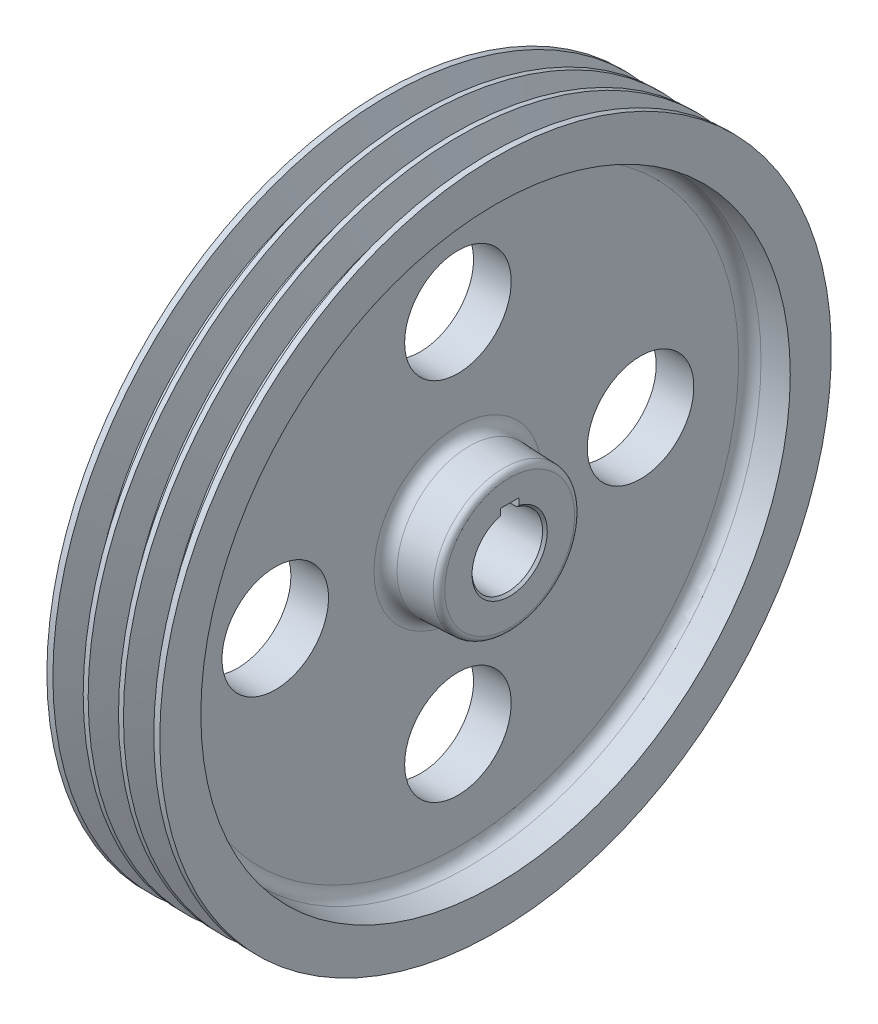
ISO-10303-21;
HEADER;
FILE_DESCRIPTION(('STEP AP214'),'2;1');
FILE_NAME('part.step','',(''),(''),'','','');
FILE_SCHEMA(('AUTOMOTIVE_DESIGN { 1 0 10303 214 1 1 1 1 }'));
ENDSEC;
DATA;
#1=APPLICATION_CONTEXT('core data for automotive mechanical design processes');
#2=APPLICATION_PROTOCOL_DEFINITION('international standard','automotive_design',2000,#1);
#3=PRODUCT_CONTEXT('',#1,'mechanical');
#4=PRODUCT('Part','Part','',(#3));
#5=PRODUCT_RELATED_PRODUCT_CATEGORY('part','',(#4));
#6=PRODUCT_DEFINITION_FORMATION('','',#4);
#7=PRODUCT_DEFINITION_CONTEXT('part definition',#1,'design');
#8=PRODUCT_DEFINITION('design','',#6,#7);
#9=PRODUCT_DEFINITION_SHAPE('','',#8);
#10=(LENGTH_UNIT() NAMED_UNIT(*) SI_UNIT(.MILLI.,.METRE.));
#11=(NAMED_UNIT(*) PLANE_ANGLE_UNIT() SI_UNIT($,.RADIAN.));
#12=(NAMED_UNIT(*) SI_UNIT($,.STERADIAN.) SOLID_ANGLE_UNIT());
#13=UNCERTAINTY_MEASURE_WITH_UNIT(LENGTH_MEASURE(1.E-05),#10,'distance_accuracy_value','');
#14=(GEOMETRIC_REPRESENTATION_CONTEXT(3) GLOBAL_UNCERTAINTY_ASSIGNED_CONTEXT((#13)) GLOBAL_UNIT_ASSIGNED_CONTEXT((#10,
#11,#12)) REPRESENTATION_CONTEXT('',''));
#15=CARTESIAN_POINT('',(0.,0.,0.));
#16=DIRECTION('',(0.,0.,1.));
#17=DIRECTION('',(1.,0.,0.));
#18=AXIS2_PLACEMENT_3D('',#15,#16,#17);
#19=CARTESIAN_POINT('',(16.,31.92475059757,0.));
#20=DIRECTION('',(1.,0.,0.));
#21=DIRECTION('',(0.,0.,-1.));
#22=AXIS2_PLACEMENT_3D('',#19,#20,#21);
#23=PLANE('',#22);
#24=CARTESIAN_POINT('',(16.,0.,0.));
#25=DIRECTION('',(1.,0.,0.));
#26=DIRECTION('',(0.,0.,-1.));
#27=AXIS2_PLACEMENT_3D('',#24,#25,#26);
#28=CIRCLE('',#27,36.5064064676572);
#29=CARTESIAN_POINT('',(16.,0.,-36.5064064676572));
#30=VERTEX_POINT('',#29);
#31=EDGE_CURVE('E344',#30,#30,#28,.T.);
#32=ORIENTED_EDGE('',*,*,#31,.T.);
#33=EDGE_LOOP('',(#32));
#34=FACE_BOUND('',#33,.T.);
#35=CARTESIAN_POINT('',(16.,0.,0.));
#36=DIRECTION('',(1.,0.,0.));
#37=DIRECTION('',(0.,0.,-1.));
#38=AXIS2_PLACEMENT_3D('',#35,#36,#37);
#39=CIRCLE('',#38,119.856121036711);
#40=CARTESIAN_POINT('',(16.,0.,-119.856121036711));
#41=VERTEX_POINT('',#40);
#42=EDGE_CURVE('E339',#41,#41,#39,.F.);
#43=ORIENTED_EDGE('',*,*,#42,.T.);
#44=EDGE_LOOP('',(#43));
#45=FACE_BOUND('',#44,.T.);
#46=CARTESIAN_POINT('',(16.,77.65,0.));
#47=DIRECTION('',(1.,0.,0.));
#48=DIRECTION('',(0.,0.,-1.));
#49=AXIS2_PLACEMENT_3D('',#46,#47,#48);
#50=CIRCLE('',#49,22.65);
#51=CARTESIAN_POINT('',(16.,77.65,-22.65));
#52=VERTEX_POINT('',#51);
#53=EDGE_CURVE('E130',#52,#52,#50,.F.);
#54=ORIENTED_EDGE('',*,*,#53,.F.);
#55=EDGE_LOOP('',(#54));
#56=FACE_BOUND('',#55,.T.);
#57=CARTESIAN_POINT('',(16.,-2.71113525961169E-13,-77.65));
#58=DIRECTION('',(1.,0.,0.));
#59=DIRECTION('',(0.,0.,-1.));
#60=AXIS2_PLACEMENT_3D('',#57,#58,#59);
#61=CIRCLE('',#60,22.65);
#62=CARTESIAN_POINT('',(16.,-2.71113525961169E-13,-100.3));
#63=VERTEX_POINT('',#62);
#64=EDGE_CURVE('E384',#63,#63,#61,.F.);
#65=ORIENTED_EDGE('',*,*,#64,.F.);
#66=EDGE_LOOP('',(#65));
#67=FACE_BOUND('',#66,.T.);
#68=CARTESIAN_POINT('',(16.,-77.65,5.42227051922339E-13));
#69=DIRECTION('',(1.,0.,0.));
#70=DIRECTION('',(0.,0.,-1.));
#71=AXIS2_PLACEMENT_3D('',#68,#69,#70);
#72=CIRCLE('',#71,22.65);
#73=CARTESIAN_POINT('',(16.,-77.65,-22.6499999999995));
#74=VERTEX_POINT('',#73);
#75=EDGE_CURVE('E388',#74,#74,#72,.F.);
#76=ORIENTED_EDGE('',*,*,#75,.F.);
#77=EDGE_LOOP('',(#76));
#78=FACE_BOUND('',#77,.T.);
#79=CARTESIAN_POINT('',(16.,8.13340577883508E-13,77.65));
#80=DIRECTION('',(1.,0.,0.));
#81=DIRECTION('',(0.,0.,-1.));
#82=AXIS2_PLACEMENT_3D('',#79,#80,#81);
#83=CIRCLE('',#82,22.65);
#84=CARTESIAN_POINT('',(16.,8.13340577883508E-13,55.));
#85=VERTEX_POINT('',#84);
#86=EDGE_CURVE('E392',#85,#85,#83,.F.);
#87=ORIENTED_EDGE('',*,*,#86,.F.);
#88=EDGE_LOOP('',(#87));
#89=FACE_BOUND('',#88,.T.);
#90=ADVANCED_FACE('F41',(#34,#45,#56,#67,#78,#89),#23,.F.);
#91=CARTESIAN_POINT('',(32.,123.900181383585,0.));
#92=DIRECTION('',(-1.,0.,0.));
#93=DIRECTION('',(0.,0.,1.));
#94=AXIS2_PLACEMENT_3D('',#91,#92,#93);
#95=PLANE('',#94);
#96=CARTESIAN_POINT('',(32.,0.,0.));
#97=DIRECTION('',(-1.,0.,0.));
#98=DIRECTION('',(0.,0.,1.));
#99=AXIS2_PLACEMENT_3D('',#96,#97,#98);
#100=CIRCLE('',#99,35.6838149775872);
#101=CARTESIAN_POINT('',(32.,0.,35.6838149775872));
#102=VERTEX_POINT('',#101);
#103=EDGE_CURVE('E357',#102,#102,#100,.T.);
#104=ORIENTED_EDGE('',*,*,#103,.T.);
#105=EDGE_LOOP('',(#104));
#106=FACE_BOUND('',#105,.T.);
#107=CARTESIAN_POINT('',(32.,0.,0.));
#108=DIRECTION('',(-1.,0.,0.));
#109=DIRECTION('',(0.,0.,1.));
#110=AXIS2_PLACEMENT_3D('',#107,#108,#109);
#111=CIRCLE('',#110,119.318525513498);
#112=CARTESIAN_POINT('',(32.,0.,119.318525513498));
#113=VERTEX_POINT('',#112);
#114=EDGE_CURVE('E353',#113,#113,#111,.F.);
#115=ORIENTED_EDGE('',*,*,#114,.T.);
#116=EDGE_LOOP('',(#115));
#117=FACE_BOUND('',#116,.T.);
#118=CARTESIAN_POINT('',(32.,77.65,0.));
#119=DIRECTION('',(-1.,0.,0.));
#120=DIRECTION('',(0.,0.,1.));
#121=AXIS2_PLACEMENT_3D('',#118,#119,#120);
#122=CIRCLE('',#121,22.65);
#123=CARTESIAN_POINT('',(32.,77.65,22.65));
#124=VERTEX_POINT('',#123);
#125=EDGE_CURVE('E380',#124,#124,#122,.F.);
#126=ORIENTED_EDGE('',*,*,#125,.F.);
#127=EDGE_LOOP('',(#126));
#128=FACE_BOUND('',#127,.T.);
#129=CARTESIAN_POINT('',(32.,-2.71113525961169E-13,-77.65));
#130=DIRECTION('',(-1.,0.,0.));
#131=DIRECTION('',(0.,0.,1.));
#132=AXIS2_PLACEMENT_3D('',#129,#130,#131);
#133=CIRCLE('',#132,22.65);
#134=CARTESIAN_POINT('',(32.,-2.71113525961169E-13,-55.));
#135=VERTEX_POINT('',#134);
#136=EDGE_CURVE('E385',#135,#135,#133,.F.);
#137=ORIENTED_EDGE('',*,*,#136,.F.);
#138=EDGE_LOOP('',(#137));
#139=FACE_BOUND('',#138,.T.);
#140=CARTESIAN_POINT('',(32.,-77.65,5.42227051922339E-13));
#141=DIRECTION('',(-1.,0.,0.));
#142=DIRECTION('',(0.,0.,1.));
#143=AXIS2_PLACEMENT_3D('',#140,#141,#142);
#144=CIRCLE('',#143,22.65);
#145=CARTESIAN_POINT('',(32.,-77.65,22.6500000000005));
#146=VERTEX_POINT('',#145);
#147=EDGE_CURVE('E389',#146,#146,#144,.F.);
#148=ORIENTED_EDGE('',*,*,#147,.F.);
#149=EDGE_LOOP('',(#148));
#150=FACE_BOUND('',#149,.T.);
#151=CARTESIAN_POINT('',(32.,8.13340577883508E-13,77.65));
#152=DIRECTION('',(-1.,0.,0.));
#153=DIRECTION('',(0.,0.,1.));
#154=AXIS2_PLACEMENT_3D('',#151,#152,#153);
#155=CIRCLE('',#154,22.65);
#156=CARTESIAN_POINT('',(32.,8.13340577883508E-13,100.3));
#157=VERTEX_POINT('',#156);
#158=EDGE_CURVE('E45',#157,#157,#155,.F.);
#159=ORIENTED_EDGE('',*,*,#158,.F.);
#160=EDGE_LOOP('',(#159));
#161=FACE_BOUND('',#160,.T.);
#162=ADVANCED_FACE('F218',(#106,#117,#128,#139,#150,#161),#95,.F.);
#163=CARTESIAN_POINT('',(0.,0.,0.));
#164=DIRECTION('',(-1.,0.,0.));
#165=DIRECTION('',(0.,0.,1.));
#166=AXIS2_PLACEMENT_3D('',#163,#164,#165);
#167=CYLINDRICAL_SURFACE('',#166,142.75);
#168=CARTESIAN_POINT('',(48.,0.,0.));
#169=DIRECTION('',(-1.,0.,0.));
#170=DIRECTION('',(0.,0.,1.));
#171=AXIS2_PLACEMENT_3D('',#168,#169,#170);
#172=CIRCLE('',#171,142.75);
#173=CARTESIAN_POINT('',(48.,0.,142.75));
#174=VERTEX_POINT('',#173);
#175=EDGE_CURVE('E275',#174,#174,#172,.T.);
#176=ORIENTED_EDGE('',*,*,#175,.T.);
#177=EDGE_LOOP('',(#176));
#178=FACE_BOUND('',#177,.T.);
#179=CARTESIAN_POINT('',(45.4469009365466,0.,0.));
#180=DIRECTION('',(-1.,0.,0.));
#181=DIRECTION('',(0.,0.,1.));
#182=AXIS2_PLACEMENT_3D('',#179,#180,#181);
#183=CIRCLE('',#182,142.75);
#184=CARTESIAN_POINT('',(45.4469009365466,0.,142.75));
#185=VERTEX_POINT('',#184);
#186=EDGE_CURVE('E319',#185,#185,#183,.T.);
#187=ORIENTED_EDGE('',*,*,#186,.F.);
#188=EDGE_LOOP('',(#187));
#189=FACE_BOUND('',#188,.T.);
#190=ADVANCED_FACE('F224',(#178,#189),#167,.T.);
#191=CARTESIAN_POINT('',(30.4469009365466,0.,0.));
#192=DIRECTION('',(-1.,0.,0.));
#193=DIRECTION('',(0.,0.,1.));
#194=AXIS2_PLACEMENT_3D('',#191,#192,#193);
#195=CIRCLE('',#194,142.75);
#196=CARTESIAN_POINT('',(30.4469009365466,0.,142.75));
#197=VERTEX_POINT('',#196);
#198=EDGE_CURVE('E303',#197,#197,#195,.T.);
#199=ORIENTED_EDGE('',*,*,#198,.F.);
#200=EDGE_LOOP('',(#199));
#201=FACE_BOUND('',#200,.T.);
#202=CARTESIAN_POINT('',(32.5530990634534,0.,0.));
#203=DIRECTION('',(-1.,0.,0.));
#204=DIRECTION('',(0.,0.,1.));
#205=AXIS2_PLACEMENT_3D('',#202,#203,#204);
#206=CIRCLE('',#205,142.75);
#207=CARTESIAN_POINT('',(32.5530990634534,0.,142.75));
#208=VERTEX_POINT('',#207);
#209=EDGE_CURVE('E323',#208,#208,#206,.T.);
#210=ORIENTED_EDGE('',*,*,#209,.T.);
#211=EDGE_LOOP('',(#210));
#212=FACE_BOUND('',#211,.T.);
#213=ADVANCED_FACE('F620',(#201,#212),#167,.T.);
#214=CARTESIAN_POINT('',(15.4469009365466,0.,0.));
#215=DIRECTION('',(-1.,0.,0.));
#216=DIRECTION('',(0.,0.,1.));
#217=AXIS2_PLACEMENT_3D('',#214,#215,#216);
#218=CIRCLE('',#217,142.75);
#219=CARTESIAN_POINT('',(15.4469009365466,0.,142.75));
#220=VERTEX_POINT('',#219);
#221=EDGE_CURVE('E287',#220,#220,#218,.T.);
#222=ORIENTED_EDGE('',*,*,#221,.F.);
#223=EDGE_LOOP('',(#222));
#224=FACE_BOUND('',#223,.T.);
#225=CARTESIAN_POINT('',(17.5530990634534,0.,0.));
#226=DIRECTION('',(-1.,0.,0.));
#227=DIRECTION('',(0.,0.,1.));
#228=AXIS2_PLACEMENT_3D('',#225,#226,#227);
#229=CIRCLE('',#228,142.75);
#230=CARTESIAN_POINT('',(17.5530990634534,0.,142.75));
#231=VERTEX_POINT('',#230);
#232=EDGE_CURVE('E307',#231,#231,#229,.T.);
#233=ORIENTED_EDGE('',*,*,#232,.T.);
#234=EDGE_LOOP('',(#233));
#235=FACE_BOUND('',#234,.T.);
#236=ADVANCED_FACE('F247',(#224,#235),#167,.T.);
#237=CARTESIAN_POINT('',(0.,0.,0.));
#238=DIRECTION('',(-1.,0.,0.));
#239=DIRECTION('',(0.,0.,1.));
#240=AXIS2_PLACEMENT_3D('',#237,#238,#239);
#241=CIRCLE('',#240,142.75);
#242=CARTESIAN_POINT('',(0.,0.,142.75));
#243=VERTEX_POINT('',#242);
#244=EDGE_CURVE('E271',#243,#243,#241,.T.);
#245=ORIENTED_EDGE('',*,*,#244,.F.);
#246=EDGE_LOOP('',(#245));
#247=FACE_BOUND('',#246,.T.);
#248=CARTESIAN_POINT('',(2.55309906345342,0.,0.));
#249=DIRECTION('',(-1.,0.,0.));
#250=DIRECTION('',(0.,0.,1.));
#251=AXIS2_PLACEMENT_3D('',#248,#249,#250);
#252=CIRCLE('',#251,142.75);
#253=CARTESIAN_POINT('',(2.55309906345342,0.,142.75));
#254=VERTEX_POINT('',#253);
#255=EDGE_CURVE('E291',#254,#254,#252,.T.);
#256=ORIENTED_EDGE('',*,*,#255,.T.);
#257=EDGE_LOOP('',(#256));
#258=FACE_BOUND('',#257,.T.);
#259=ADVANCED_FACE('F242',(#247,#258),#167,.T.);
#260=CARTESIAN_POINT('',(0.,0.,0.));
#261=DIRECTION('',(-1.,0.,0.));
#262=DIRECTION('',(0.,0.,1.));
#263=AXIS2_PLACEMENT_3D('',#260,#261,#262);
#264=CYLINDRICAL_SURFACE('',#263,15.);
#265=CARTESIAN_POINT('',(-4.99999999999998,0.,0.));
#266=DIRECTION('',(1.,0.,0.));
#267=DIRECTION('',(0.,0.,-1.));
#268=AXIS2_PLACEMENT_3D('',#265,#266,#267);
#269=CIRCLE('',#268,15.);
#270=CARTESIAN_POINT('',(-4.99999999999998,14.456832294801,-4.));
#271=VERTEX_POINT('',#270);
#272=CARTESIAN_POINT('',(-4.99999999999998,14.456832294801,4.));
#273=VERTEX_POINT('',#272);
#274=EDGE_CURVE('E253',#271,#273,#269,.F.);
#275=ORIENTED_EDGE('',*,*,#274,.T.);
#276=DIRECTION('',(-1.,0.,0.));
#277=VECTOR('',#276,1.);
#278=CARTESIAN_POINT('',(54.,14.456832294801,4.));
#279=LINE('',#278,#277);
#280=CARTESIAN_POINT('',(53.,14.456832294801,4.));
#281=VERTEX_POINT('',#280);
#282=EDGE_CURVE('E105',#281,#273,#279,.T.);
#283=ORIENTED_EDGE('',*,*,#282,.F.);
#284=CARTESIAN_POINT('',(53.,0.,0.));
#285=DIRECTION('',(-1.,0.,0.));
#286=DIRECTION('',(0.,0.,1.));
#287=AXIS2_PLACEMENT_3D('',#284,#285,#286);
#288=CIRCLE('',#287,15.);
#289=CARTESIAN_POINT('',(53.,14.456832294801,-4.));
#290=VERTEX_POINT('',#289);
#291=EDGE_CURVE('E260',#281,#290,#288,.F.);
#292=ORIENTED_EDGE('',*,*,#291,.T.);
#293=DIRECTION('',(-1.,0.,0.));
#294=VECTOR('',#293,1.);
#295=CARTESIAN_POINT('',(54.,14.456832294801,-4.));
#296=LINE('',#295,#294);
#297=EDGE_CURVE('E114',#290,#271,#296,.T.);
#298=ORIENTED_EDGE('',*,*,#297,.T.);
#299=EDGE_LOOP('',(#275,#283,#292,#298));
#300=FACE_BOUND('',#299,.T.);
#301=ADVANCED_FACE('F239',(#300),#264,.F.);
#302=CARTESIAN_POINT('',(-5.99999999999999,15.,0.));
#303=DIRECTION('',(1.,0.,0.));
#304=DIRECTION('',(0.,0.,-1.));
#305=AXIS2_PLACEMENT_3D('',#302,#303,#304);
#306=PLANE('',#305);
#307=CARTESIAN_POINT('',(-5.99999999999999,0.,0.));
#308=DIRECTION('',(1.,0.,0.));
#309=DIRECTION('',(0.,0.,-1.));
#310=AXIS2_PLACEMENT_3D('',#307,#308,#309);
#311=CIRCLE('',#310,27.7091720649564);
#312=CARTESIAN_POINT('',(-5.99999999999999,0.,-27.7091720649564));
#313=VERTEX_POINT('',#312);
#314=EDGE_CURVE('E51',#313,#313,#311,.F.);
#315=ORIENTED_EDGE('',*,*,#314,.T.);
#316=EDGE_LOOP('',(#315));
#317=FACE_BOUND('',#316,.T.);
#318=CARTESIAN_POINT('',(-5.99999999999999,0.,0.));
#319=DIRECTION('',(1.,0.,0.));
#320=DIRECTION('',(0.,0.,-1.));
#321=AXIS2_PLACEMENT_3D('',#318,#319,#320);
#322=CIRCLE('',#321,16.);
#323=CARTESIAN_POINT('',(-5.99999999999999,15.4919333848297,4.));
#324=VERTEX_POINT('',#323);
#325=CARTESIAN_POINT('',(-5.99999999999999,15.4919333848297,-4.));
#326=VERTEX_POINT('',#325);
#327=EDGE_CURVE('E259',#324,#326,#322,.T.);
#328=ORIENTED_EDGE('',*,*,#327,.T.);
#329=DIRECTION('',(0.,-1.,0.));
#330=VECTOR('',#329,1.);
#331=CARTESIAN_POINT('',(-5.99999999999999,14.456832294801,-4.));
#332=LINE('',#331,#330);
#333=CARTESIAN_POINT('',(-5.99999999999999,18.2999999523163,-4.));
#334=VERTEX_POINT('',#333);
#335=EDGE_CURVE('E67',#334,#326,#332,.T.);
#336=ORIENTED_EDGE('',*,*,#335,.F.);
#337=DIRECTION('',(0.,0.,-1.));
#338=VECTOR('',#337,1.);
#339=CARTESIAN_POINT('',(-5.99999999999999,18.2999999523163,-4.));
#340=LINE('',#339,#338);
#341=CARTESIAN_POINT('',(-5.99999999999999,18.2999999523163,4.));
#342=VERTEX_POINT('',#341);
#343=EDGE_CURVE('E124',#342,#334,#340,.T.);
#344=ORIENTED_EDGE('',*,*,#343,.F.);
#345=DIRECTION('',(0.,1.,0.));
#346=VECTOR('',#345,1.);
#347=CARTESIAN_POINT('',(-5.99999999999999,14.456832294801,4.));
#348=LINE('',#347,#346);
#349=EDGE_CURVE('E99',#324,#342,#348,.T.);
#350=ORIENTED_EDGE('',*,*,#349,.F.);
#351=EDGE_LOOP('',(#328,#336,#344,#350));
#352=FACE_BOUND('',#351,.T.);
#353=ADVANCED_FACE('F236',(#317,#352),#306,.F.);
#354=CARTESIAN_POINT('',(16.,0.,0.));
#355=DIRECTION('',(1.,0.,0.));
#356=DIRECTION('',(0.,0.,-1.));
#357=AXIS2_PLACEMENT_3D('',#354,#355,#356);
#358=CONICAL_SURFACE('',#357,31.92475059757,0.0872664625997025);
#359=CARTESIAN_POINT('',(-3.71788935686906,0.,0.));
#360=DIRECTION('',(-1.,0.,0.));
#361=DIRECTION('',(0.,0.,1.));
#362=AXIS2_PLACEMENT_3D('',#359,#360,#361);
#363=CIRCLE('',#362,30.1996588101858);
#364=CARTESIAN_POINT('',(-3.71788935686906,0.,30.1996588101858));
#365=VERTEX_POINT('',#364);
#366=EDGE_CURVE('E11',#365,#365,#363,.F.);
#367=ORIENTED_EDGE('',*,*,#366,.T.);
#368=EDGE_LOOP('',(#367));
#369=FACE_BOUND('',#368,.T.);
#370=CARTESIAN_POINT('',(11.4357787137382,0.,0.));
#371=DIRECTION('',(1.,0.,0.));
#372=DIRECTION('',(0.,0.,-1.));
#373=AXIS2_PLACEMENT_3D('',#370,#371,#372);
#374=CIRCLE('',#373,31.5254329771985);
#375=CARTESIAN_POINT('',(11.4357787137382,0.,-31.5254329771985));
#376=VERTEX_POINT('',#375);
#377=EDGE_CURVE('E336',#376,#376,#374,.F.);
#378=ORIENTED_EDGE('',*,*,#377,.T.);
#379=EDGE_LOOP('',(#378));
#380=FACE_BOUND('',#379,.T.);
#381=ADVANCED_FACE('F233',(#369,#380),#358,.T.);
#382=CARTESIAN_POINT('',(0.,0.,0.));
#383=DIRECTION('',(-1.,0.,0.));
#384=DIRECTION('',(0.,0.,1.));
#385=AXIS2_PLACEMENT_3D('',#382,#383,#384);
#386=CONICAL_SURFACE('',#385,125.3,0.0399680398706702);
#387=CARTESIAN_POINT('',(11.1997869980079,0.,0.));
#388=DIRECTION('',(-1.,0.,0.));
#389=DIRECTION('',(0.,0.,1.));
#390=AXIS2_PLACEMENT_3D('',#387,#388,#389);
#391=CIRCLE('',#390,124.852127957785);
#392=CARTESIAN_POINT('',(11.1997869980079,0.,124.852127957785));
#393=VERTEX_POINT('',#392);
#394=EDGE_CURVE('E349',#393,#393,#391,.F.);
#395=ORIENTED_EDGE('',*,*,#394,.T.);
#396=EDGE_LOOP('',(#395));
#397=FACE_BOUND('',#396,.T.);
#398=CARTESIAN_POINT('',(0.,0.,0.));
#399=DIRECTION('',(-1.,0.,0.));
#400=DIRECTION('',(0.,0.,1.));
#401=AXIS2_PLACEMENT_3D('',#398,#399,#400);
#402=CIRCLE('',#401,125.3);
#403=CARTESIAN_POINT('',(0.,0.,125.3));
#404=VERTEX_POINT('',#403);
#405=EDGE_CURVE('E265',#404,#404,#402,.T.);
#406=ORIENTED_EDGE('',*,*,#405,.T.);
#407=EDGE_LOOP('',(#406));
#408=FACE_BOUND('',#407,.T.);
#409=ADVANCED_FACE('F231',(#397,#408),#386,.F.);
#410=CARTESIAN_POINT('',(0.,125.3,0.));
#411=DIRECTION('',(1.,0.,0.));
#412=DIRECTION('',(0.,0.,-1.));
#413=AXIS2_PLACEMENT_3D('',#410,#411,#412);
#414=PLANE('',#413);
#415=ORIENTED_EDGE('',*,*,#405,.F.);
#416=EDGE_LOOP('',(#415));
#417=FACE_BOUND('',#416,.T.);
#418=ORIENTED_EDGE('',*,*,#244,.T.);
#419=EDGE_LOOP('',(#418));
#420=FACE_BOUND('',#419,.T.);
#421=ADVANCED_FACE('F693',(#417,#420),#414,.F.);
#422=CARTESIAN_POINT('',(48.,142.75,0.));
#423=DIRECTION('',(-1.,0.,0.));
#424=DIRECTION('',(0.,0.,1.));
#425=AXIS2_PLACEMENT_3D('',#422,#423,#424);
#426=PLANE('',#425);
#427=ORIENTED_EDGE('',*,*,#175,.F.);
#428=EDGE_LOOP('',(#427));
#429=FACE_BOUND('',#428,.T.);
#430=CARTESIAN_POINT('',(48.,0.,0.));
#431=DIRECTION('',(-1.,0.,0.));
#432=DIRECTION('',(0.,0.,1.));
#433=AXIS2_PLACEMENT_3D('',#430,#431,#432);
#434=CIRCLE('',#433,125.3);
#435=CARTESIAN_POINT('',(48.,0.,125.3));
#436=VERTEX_POINT('',#435);
#437=EDGE_CURVE('E279',#436,#436,#434,.T.);
#438=ORIENTED_EDGE('',*,*,#437,.T.);
#439=EDGE_LOOP('',(#438));
#440=FACE_BOUND('',#439,.T.);
#441=ADVANCED_FACE('F644',(#429,#440),#426,.F.);
#442=CARTESIAN_POINT('',(32.,0.,0.));
#443=DIRECTION('',(1.,0.,0.));
#444=DIRECTION('',(0.,0.,-1.));
#445=AXIS2_PLACEMENT_3D('',#442,#443,#444);
#446=CONICAL_SURFACE('',#445,123.900181383585,0.0872664625997023);
#447=CARTESIAN_POINT('',(36.5642212862618,0.,0.));
#448=DIRECTION('',(1.,0.,0.));
#449=DIRECTION('',(0.,0.,-1.));
#450=AXIS2_PLACEMENT_3D('',#447,#448,#449);
#451=CIRCLE('',#450,124.299499003957);
#452=CARTESIAN_POINT('',(36.5642212862618,0.,-124.299499003957));
#453=VERTEX_POINT('',#452);
#454=EDGE_CURVE('E365',#453,#453,#451,.F.);
#455=ORIENTED_EDGE('',*,*,#454,.T.);
#456=EDGE_LOOP('',(#455));
#457=FACE_BOUND('',#456,.T.);
#458=ORIENTED_EDGE('',*,*,#437,.F.);
#459=EDGE_LOOP('',(#458));
#460=FACE_BOUND('',#459,.T.);
#461=ADVANCED_FACE('F687',(#457,#460),#446,.F.);
#462=CARTESIAN_POINT('',(54.,0.,0.));
#463=DIRECTION('',(-1.,0.,0.));
#464=DIRECTION('',(0.,0.,1.));
#465=AXIS2_PLACEMENT_3D('',#462,#463,#464);
#466=CONICAL_SURFACE('',#465,30.,0.0399680398706699);
#467=CARTESIAN_POINT('',(51.5998934990038,0.,0.));
#468=DIRECTION('',(1.,0.,0.));
#469=DIRECTION('',(0.,0.,-1.));
#470=AXIS2_PLACEMENT_3D('',#467,#468,#469);
#471=CIRCLE('',#470,30.0959786646232);
#472=CARTESIAN_POINT('',(51.5998934990038,0.,-30.0959786646232));
#473=VERTEX_POINT('',#472);
#474=EDGE_CURVE('E369',#473,#473,#471,.F.);
#475=ORIENTED_EDGE('',*,*,#474,.T.);
#476=EDGE_LOOP('',(#475));
#477=FACE_BOUND('',#476,.T.);
#478=CARTESIAN_POINT('',(36.8002130019921,0.,0.));
#479=DIRECTION('',(-1.,0.,0.));
#480=DIRECTION('',(0.,0.,1.));
#481=AXIS2_PLACEMENT_3D('',#478,#479,#480);
#482=CIRCLE('',#481,30.6878080565125);
#483=CARTESIAN_POINT('',(36.8002130019921,0.,30.6878080565125));
#484=VERTEX_POINT('',#483);
#485=EDGE_CURVE('E361',#484,#484,#482,.F.);
#486=ORIENTED_EDGE('',*,*,#485,.T.);
#487=EDGE_LOOP('',(#486));
#488=FACE_BOUND('',#487,.T.);
#489=ADVANCED_FACE('F684',(#477,#488),#466,.T.);
#490=CARTESIAN_POINT('',(54.,30.,0.));
#491=DIRECTION('',(-1.,0.,0.));
#492=DIRECTION('',(0.,0.,1.));
#493=AXIS2_PLACEMENT_3D('',#490,#491,#492);
#494=PLANE('',#493);
#495=CARTESIAN_POINT('',(54.,0.,0.));
#496=DIRECTION('',(-1.,0.,0.));
#497=DIRECTION('',(0.,0.,1.));
#498=AXIS2_PLACEMENT_3D('',#495,#496,#497);
#499=CIRCLE('',#498,27.5979752040859);
#500=CARTESIAN_POINT('',(54.,0.,27.5979752040859));
#501=VERTEX_POINT('',#500);
#502=EDGE_CURVE('E373',#501,#501,#499,.F.);
#503=ORIENTED_EDGE('',*,*,#502,.T.);
#504=EDGE_LOOP('',(#503));
#505=FACE_BOUND('',#504,.T.);
#506=DIRECTION('',(0.,0.,-1.));
#507=VECTOR('',#506,1.);
#508=CARTESIAN_POINT('',(54.,18.2999999523163,-4.));
#509=LINE('',#508,#507);
#510=CARTESIAN_POINT('',(54.,18.2999999523163,4.));
#511=VERTEX_POINT('',#510);
#512=CARTESIAN_POINT('',(54.,18.2999999523163,-4.));
#513=VERTEX_POINT('',#512);
#514=EDGE_CURVE('E108',#511,#513,#509,.T.);
#515=ORIENTED_EDGE('',*,*,#514,.T.);
#516=DIRECTION('',(0.,-1.,0.));
#517=VECTOR('',#516,1.);
#518=CARTESIAN_POINT('',(54.,14.456832294801,-4.));
#519=LINE('',#518,#517);
#520=CARTESIAN_POINT('',(54.,15.4919333848296,-4.));
#521=VERTEX_POINT('',#520);
#522=EDGE_CURVE('E121',#513,#521,#519,.T.);
#523=ORIENTED_EDGE('',*,*,#522,.T.);
#524=CARTESIAN_POINT('',(54.,0.,0.));
#525=DIRECTION('',(-1.,0.,0.));
#526=DIRECTION('',(0.,0.,1.));
#527=AXIS2_PLACEMENT_3D('',#524,#525,#526);
#528=CIRCLE('',#527,16.);
#529=CARTESIAN_POINT('',(54.,15.4919333848296,4.));
#530=VERTEX_POINT('',#529);
#531=EDGE_CURVE('E119',#521,#530,#528,.T.);
#532=ORIENTED_EDGE('',*,*,#531,.T.);
#533=DIRECTION('',(0.,1.,0.));
#534=VECTOR('',#533,1.);
#535=CARTESIAN_POINT('',(54.,14.456832294801,4.));
#536=LINE('',#535,#534);
#537=EDGE_CURVE('E59',#530,#511,#536,.T.);
#538=ORIENTED_EDGE('',*,*,#537,.T.);
#539=EDGE_LOOP('',(#515,#523,#532,#538));
#540=FACE_BOUND('',#539,.T.);
#541=ADVANCED_FACE('F117',(#505,#540),#494,.F.);
#542=CARTESIAN_POINT('',(0.,0.,0.));
#543=DIRECTION('',(-1.,0.,0.));
#544=DIRECTION('',(0.,0.,1.));
#545=AXIS2_PLACEMENT_3D('',#542,#543,#544);
#546=CYLINDRICAL_SURFACE('',#545,131.3);
#547=CARTESIAN_POINT('',(11.50434976438,0.,0.));
#548=DIRECTION('',(-1.,0.,0.));
#549=DIRECTION('',(0.,0.,1.));
#550=AXIS2_PLACEMENT_3D('',#547,#548,#549);
#551=CIRCLE('',#550,131.3);
#552=CARTESIAN_POINT('',(11.50434976438,0.,131.3));
#553=VERTEX_POINT('',#552);
#554=EDGE_CURVE('E283',#553,#553,#551,.T.);
#555=ORIENTED_EDGE('',*,*,#554,.T.);
#556=EDGE_LOOP('',(#555));
#557=FACE_BOUND('',#556,.T.);
#558=CARTESIAN_POINT('',(6.49565023562004,0.,0.));
#559=DIRECTION('',(-1.,0.,0.));
#560=DIRECTION('',(0.,0.,1.));
#561=AXIS2_PLACEMENT_3D('',#558,#559,#560);
#562=CIRCLE('',#561,131.3);
#563=CARTESIAN_POINT('',(6.49565023562004,0.,131.3));
#564=VERTEX_POINT('',#563);
#565=EDGE_CURVE('E295',#564,#564,#562,.T.);
#566=ORIENTED_EDGE('',*,*,#565,.F.);
#567=EDGE_LOOP('',(#566));
#568=FACE_BOUND('',#567,.T.);
#569=ADVANCED_FACE('F649',(#557,#568),#546,.T.);
#570=CARTESIAN_POINT('',(11.50434976438,0.,0.));
#571=DIRECTION('',(1.,0.,0.));
#572=DIRECTION('',(0.,0.,-1.));
#573=AXIS2_PLACEMENT_3D('',#570,#571,#572);
#574=CONICAL_SURFACE('',#573,131.3,1.23918376891598);
#575=ORIENTED_EDGE('',*,*,#221,.T.);
#576=EDGE_LOOP('',(#575));
#577=FACE_BOUND('',#576,.T.);
#578=ORIENTED_EDGE('',*,*,#554,.F.);
#579=EDGE_LOOP('',(#578));
#580=FACE_BOUND('',#579,.T.);
#581=ADVANCED_FACE('F653',(#577,#580),#574,.T.);
#582=CARTESIAN_POINT('',(2.55309906345342,0.,0.));
#583=DIRECTION('',(-1.,0.,0.));
#584=DIRECTION('',(0.,0.,1.));
#585=AXIS2_PLACEMENT_3D('',#582,#583,#584);
#586=CONICAL_SURFACE('',#585,142.75,1.23918376891598);
#587=ORIENTED_EDGE('',*,*,#565,.T.);
#588=EDGE_LOOP('',(#587));
#589=FACE_BOUND('',#588,.T.);
#590=ORIENTED_EDGE('',*,*,#255,.F.);
#591=EDGE_LOOP('',(#590));
#592=FACE_BOUND('',#591,.T.);
#593=ADVANCED_FACE('F497',(#589,#592),#586,.T.);
#594=CARTESIAN_POINT('',(15.,0.,0.));
#595=DIRECTION('',(-1.,0.,0.));
#596=DIRECTION('',(0.,0.,1.));
#597=AXIS2_PLACEMENT_3D('',#594,#595,#596);
#598=CYLINDRICAL_SURFACE('',#597,131.3);
#599=CARTESIAN_POINT('',(26.50434976438,0.,0.));
#600=DIRECTION('',(-1.,0.,0.));
#601=DIRECTION('',(0.,0.,1.));
#602=AXIS2_PLACEMENT_3D('',#599,#600,#601);
#603=CIRCLE('',#602,131.3);
#604=CARTESIAN_POINT('',(26.50434976438,0.,131.3));
#605=VERTEX_POINT('',#604);
#606=EDGE_CURVE('E299',#605,#605,#603,.T.);
#607=ORIENTED_EDGE('',*,*,#606,.T.);
#608=EDGE_LOOP('',(#607));
#609=FACE_BOUND('',#608,.T.);
#610=CARTESIAN_POINT('',(21.49565023562,0.,0.));
#611=DIRECTION('',(-1.,0.,0.));
#612=DIRECTION('',(0.,0.,1.));
#613=AXIS2_PLACEMENT_3D('',#610,#611,#612);
#614=CIRCLE('',#613,131.3);
#615=CARTESIAN_POINT('',(21.49565023562,0.,131.3));
#616=VERTEX_POINT('',#615);
#617=EDGE_CURVE('E311',#616,#616,#614,.T.);
#618=ORIENTED_EDGE('',*,*,#617,.F.);
#619=EDGE_LOOP('',(#618));
#620=FACE_BOUND('',#619,.T.);
#621=ADVANCED_FACE('F491',(#609,#620),#598,.T.);
#622=CARTESIAN_POINT('',(26.50434976438,0.,0.));
#623=DIRECTION('',(1.,0.,0.));
#624=DIRECTION('',(0.,0.,-1.));
#625=AXIS2_PLACEMENT_3D('',#622,#623,#624);
#626=CONICAL_SURFACE('',#625,131.3,1.23918376891598);
#627=ORIENTED_EDGE('',*,*,#198,.T.);
#628=EDGE_LOOP('',(#627));
#629=FACE_BOUND('',#628,.T.);
#630=ORIENTED_EDGE('',*,*,#606,.F.);
#631=EDGE_LOOP('',(#630));
#632=FACE_BOUND('',#631,.T.);
#633=ADVANCED_FACE('F496',(#629,#632),#626,.T.);
#634=CARTESIAN_POINT('',(17.5530990634534,0.,0.));
#635=DIRECTION('',(-1.,0.,0.));
#636=DIRECTION('',(0.,0.,1.));
#637=AXIS2_PLACEMENT_3D('',#634,#635,#636);
#638=CONICAL_SURFACE('',#637,142.75,1.23918376891598);
#639=ORIENTED_EDGE('',*,*,#617,.T.);
#640=EDGE_LOOP('',(#639));
#641=FACE_BOUND('',#640,.T.);
#642=ORIENTED_EDGE('',*,*,#232,.F.);
#643=EDGE_LOOP('',(#642));
#644=FACE_BOUND('',#643,.T.);
#645=ADVANCED_FACE('F465',(#641,#644),#638,.T.);
#646=CARTESIAN_POINT('',(30.,0.,0.));
#647=DIRECTION('',(-1.,0.,0.));
#648=DIRECTION('',(0.,0.,1.));
#649=AXIS2_PLACEMENT_3D('',#646,#647,#648);
#650=CYLINDRICAL_SURFACE('',#649,131.3);
#651=CARTESIAN_POINT('',(41.50434976438,0.,0.));
#652=DIRECTION('',(-1.,0.,0.));
#653=DIRECTION('',(0.,0.,1.));
#654=AXIS2_PLACEMENT_3D('',#651,#652,#653);
#655=CIRCLE('',#654,131.3);
#656=CARTESIAN_POINT('',(41.50434976438,0.,131.3));
#657=VERTEX_POINT('',#656);
#658=EDGE_CURVE('E315',#657,#657,#655,.T.);
#659=ORIENTED_EDGE('',*,*,#658,.T.);
#660=EDGE_LOOP('',(#659));
#661=FACE_BOUND('',#660,.T.);
#662=CARTESIAN_POINT('',(36.49565023562,0.,0.));
#663=DIRECTION('',(-1.,0.,0.));
#664=DIRECTION('',(0.,0.,1.));
#665=AXIS2_PLACEMENT_3D('',#662,#663,#664);
#666=CIRCLE('',#665,131.3);
#667=CARTESIAN_POINT('',(36.49565023562,0.,131.3));
#668=VERTEX_POINT('',#667);
#669=EDGE_CURVE('E326',#668,#668,#666,.T.);
#670=ORIENTED_EDGE('',*,*,#669,.F.);
#671=EDGE_LOOP('',(#670));
#672=FACE_BOUND('',#671,.T.);
#673=ADVANCED_FACE('F459',(#661,#672),#650,.T.);
#674=CARTESIAN_POINT('',(41.50434976438,0.,0.));
#675=DIRECTION('',(1.,0.,0.));
#676=DIRECTION('',(0.,0.,-1.));
#677=AXIS2_PLACEMENT_3D('',#674,#675,#676);
#678=CONICAL_SURFACE('',#677,131.3,1.23918376891598);
#679=ORIENTED_EDGE('',*,*,#186,.T.);
#680=EDGE_LOOP('',(#679));
#681=FACE_BOUND('',#680,.T.);
#682=ORIENTED_EDGE('',*,*,#658,.F.);
#683=EDGE_LOOP('',(#682));
#684=FACE_BOUND('',#683,.T.);
#685=ADVANCED_FACE('F464',(#681,#684),#678,.T.);
#686=CARTESIAN_POINT('',(32.5530990634534,0.,0.));
#687=DIRECTION('',(-1.,0.,0.));
#688=DIRECTION('',(0.,0.,1.));
#689=AXIS2_PLACEMENT_3D('',#686,#687,#688);
#690=CONICAL_SURFACE('',#689,142.75,1.23918376891598);
#691=ORIENTED_EDGE('',*,*,#669,.T.);
#692=EDGE_LOOP('',(#691));
#693=FACE_BOUND('',#692,.T.);
#694=ORIENTED_EDGE('',*,*,#209,.F.);
#695=EDGE_LOOP('',(#694));
#696=FACE_BOUND('',#695,.T.);
#697=ADVANCED_FACE('F475',(#693,#696),#690,.T.);
#698=CARTESIAN_POINT('',(-4.99999999999998,0.,0.));
#699=DIRECTION('',(-1.,0.,0.));
#700=DIRECTION('',(0.,0.,1.));
#701=AXIS2_PLACEMENT_3D('',#698,#699,#700);
#702=CONICAL_SURFACE('',#701,15.,0.785398163397451);
#703=CARTESIAN_POINT('',(-8.13496667117584,17.6883299427803,-4.));
#704=CARTESIAN_POINT('',(-7.72010842729733,17.2629775371572,-4.));
#705=CARTESIAN_POINT('',(-7.30560413146825,16.8372791210759,-4.));
#706=CARTESIAN_POINT('',(-6.47753477005144,15.9849766526052,-4.));
#707=CARTESIAN_POINT('',(-6.06396969686238,15.5583726075999,-4.));
#708=CARTESIAN_POINT('',(-5.23800187131364,14.7040368149079,-4.));
#709=CARTESIAN_POINT('',(-4.82559912317255,14.2763050631392,-4.));
#710=CARTESIAN_POINT('',(-4.0023329280438,13.4193564456888,-4.));
#711=CARTESIAN_POINT('',(-3.59146949368942,12.9901395678739,-4.));
#712=CARTESIAN_POINT('',(-3.18156683558537,12.5600041497208,-4.));
#713=B_SPLINE_CURVE_WITH_KNOTS('',3,(#703,#704,#705,#706,#707,#708,#709,#710,#711,#712),
.UNSPECIFIED.,.F.,.F.,(4,2,2,2,4),(0.,1.78249553763699,3.56497659736639,5.34746411817459,
7.12996623610846),.UNSPECIFIED.);
#714=EDGE_CURVE('E151',#326,#271,#713,.T.);
#715=ORIENTED_EDGE('',*,*,#714,.F.);
#716=ORIENTED_EDGE('',*,*,#327,.F.);
#717=CARTESIAN_POINT('',(-3.18156683558537,12.5600041497208,4.));
#718=CARTESIAN_POINT('',(-3.59146949368942,12.9901395678739,4.));
#719=CARTESIAN_POINT('',(-4.0023329280438,13.4193564456888,4.));
#720=CARTESIAN_POINT('',(-4.82559912317255,14.2763050631392,4.));
#721=CARTESIAN_POINT('',(-5.23800187131365,14.7040368149079,4.));
#722=CARTESIAN_POINT('',(-6.06396969686238,15.5583726075999,4.));
#723=CARTESIAN_POINT('',(-6.47753477005144,15.9849766526053,4.));
#724=CARTESIAN_POINT('',(-7.30560413146825,16.8372791210759,4.));
#725=CARTESIAN_POINT('',(-7.72010842729733,17.2629775371572,4.));
#726=CARTESIAN_POINT('',(-8.13496667117584,17.6883299427803,4.));
#727=B_SPLINE_CURVE_WITH_KNOTS('',3,(#717,#718,#719,#720,#721,#722,#723,#724,#725,#726),
.UNSPECIFIED.,.F.,.F.,(4,2,2,2,4),(0.,1.78250211793388,3.56498963874207,5.34747069847147,
7.12996623610846),.UNSPECIFIED.);
#728=EDGE_CURVE('E136',#273,#324,#727,.T.);
#729=ORIENTED_EDGE('',*,*,#728,.F.);
#730=ORIENTED_EDGE('',*,*,#274,.F.);
#731=EDGE_LOOP('',(#715,#716,#729,#730));
#732=FACE_BOUND('',#731,.T.);
#733=ADVANCED_FACE('F158',(#732),#702,.F.);
#734=CARTESIAN_POINT('',(54.,0.,0.));
#735=DIRECTION('',(1.,0.,0.));
#736=DIRECTION('',(0.,0.,-1.));
#737=AXIS2_PLACEMENT_3D('',#734,#735,#736);
#738=CONICAL_SURFACE('',#737,16.,0.785398163397444);
#739=CARTESIAN_POINT('',(50.7508627279451,12.1072086092088,-4.));
#740=CARTESIAN_POINT('',(51.1600195489068,12.5380559055958,-4.));
#741=CARTESIAN_POINT('',(51.5702411872257,12.9678883062203,-4.));
#742=CARTESIAN_POINT('',(52.3923802999336,13.8259206898478,-4.));
#743=CARTESIAN_POINT('',(52.8042977576738,14.254120688798,-4.));
#744=CARTESIAN_POINT('',(53.6294009031839,15.1092921608816,-4.));
#745=CARTESIAN_POINT('',(54.0425865852922,15.5362636394831,-4.));
#746=CARTESIAN_POINT('',(54.8699775301955,16.3892258117472,-4.));
#747=CARTESIAN_POINT('',(55.2841828028489,16.8152164958488,-4.));
#748=CARTESIAN_POINT('',(55.6987686176259,17.2408355534254,-4.));
#749=B_SPLINE_CURVE_WITH_KNOTS('',3,(#739,#740,#741,#742,#743,#744,#745,#746,#747,#748),
.UNSPECIFIED.,.F.,.F.,(4,2,2,2,4),(0.,1.78250615092108,3.56499484338139,5.34747558988672,
7.12997363938311),.UNSPECIFIED.);
#750=EDGE_CURVE('E180',#290,#521,#749,.T.);
#751=ORIENTED_EDGE('',*,*,#750,.F.);
#752=ORIENTED_EDGE('',*,*,#291,.F.);
#753=CARTESIAN_POINT('',(55.6987686176259,17.2408355534254,4.));
#754=CARTESIAN_POINT('',(55.2841828028489,16.8152164958488,4.));
#755=CARTESIAN_POINT('',(54.8699775301955,16.3892258117472,4.));
#756=CARTESIAN_POINT('',(54.0425865852922,15.5362636394831,4.));
#757=CARTESIAN_POINT('',(53.6294009031839,15.1092921608816,4.));
#758=CARTESIAN_POINT('',(52.8042977576738,14.254120688798,4.));
#759=CARTESIAN_POINT('',(52.3923802999336,13.8259206898478,4.));
#760=CARTESIAN_POINT('',(51.5702411872256,12.9678883062203,4.));
#761=CARTESIAN_POINT('',(51.1600195489068,12.5380559055958,4.));
#762=CARTESIAN_POINT('',(50.7508627279451,12.1072086092088,4.));
#763=B_SPLINE_CURVE_WITH_KNOTS('',3,(#753,#754,#755,#756,#757,#758,#759,#760,#761,#762),
.UNSPECIFIED.,.F.,.F.,(4,2,2,2,4),(0.,1.78249804949639,3.56497879600171,5.34746748846203,
7.12997363938311),.UNSPECIFIED.);
#764=EDGE_CURVE('E172',#530,#281,#763,.T.);
#765=ORIENTED_EDGE('',*,*,#764,.F.);
#766=ORIENTED_EDGE('',*,*,#531,.F.);
#767=EDGE_LOOP('',(#751,#752,#765,#766));
#768=FACE_BOUND('',#767,.T.);
#769=ADVANCED_FACE('F187',(#768),#738,.F.);
#770=CARTESIAN_POINT('',(54.,14.456832294801,-4.));
#771=DIRECTION('',(0.,0.,-1.));
#772=DIRECTION('',(-1.,0.,0.));
#773=AXIS2_PLACEMENT_3D('',#770,#771,#772);
#774=PLANE('',#773);
#775=ORIENTED_EDGE('',*,*,#714,.T.);
#776=ORIENTED_EDGE('',*,*,#297,.F.);
#777=ORIENTED_EDGE('',*,*,#750,.T.);
#778=ORIENTED_EDGE('',*,*,#522,.F.);
#779=DIRECTION('',(-1.,0.,0.));
#780=VECTOR('',#779,1.);
#781=CARTESIAN_POINT('',(54.,18.2999999523163,-4.));
#782=LINE('',#781,#780);
#783=EDGE_CURVE('E104',#513,#334,#782,.T.);
#784=ORIENTED_EDGE('',*,*,#783,.T.);
#785=ORIENTED_EDGE('',*,*,#335,.T.);
#786=EDGE_LOOP('',(#775,#776,#777,#778,#784,#785));
#787=FACE_BOUND('',#786,.T.);
#788=ADVANCED_FACE('F167',(#787),#774,.F.);
#789=CARTESIAN_POINT('',(54.,18.2999999523163,-4.));
#790=DIRECTION('',(0.,1.,0.));
#791=DIRECTION('',(0.,0.,1.));
#792=AXIS2_PLACEMENT_3D('',#789,#790,#791);
#793=PLANE('',#792);
#794=ORIENTED_EDGE('',*,*,#343,.T.);
#795=ORIENTED_EDGE('',*,*,#783,.F.);
#796=ORIENTED_EDGE('',*,*,#514,.F.);
#797=DIRECTION('',(-1.,0.,0.));
#798=VECTOR('',#797,1.);
#799=CARTESIAN_POINT('',(54.,18.2999999523163,4.));
#800=LINE('',#799,#798);
#801=EDGE_CURVE('E95',#511,#342,#800,.T.);
#802=ORIENTED_EDGE('',*,*,#801,.T.);
#803=EDGE_LOOP('',(#794,#795,#796,#802));
#804=FACE_BOUND('',#803,.T.);
#805=ADVANCED_FACE('F109',(#804),#793,.F.);
#806=CARTESIAN_POINT('',(54.,14.456832294801,4.));
#807=DIRECTION('',(0.,0.,1.));
#808=DIRECTION('',(1.,0.,0.));
#809=AXIS2_PLACEMENT_3D('',#806,#807,#808);
#810=PLANE('',#809);
#811=ORIENTED_EDGE('',*,*,#728,.T.);
#812=ORIENTED_EDGE('',*,*,#349,.T.);
#813=ORIENTED_EDGE('',*,*,#801,.F.);
#814=ORIENTED_EDGE('',*,*,#537,.F.);
#815=ORIENTED_EDGE('',*,*,#764,.T.);
#816=ORIENTED_EDGE('',*,*,#282,.T.);
#817=EDGE_LOOP('',(#811,#812,#813,#814,#815,#816));
#818=FACE_BOUND('',#817,.T.);
#819=ADVANCED_FACE('F97',(#818),#810,.F.);
#820=CARTESIAN_POINT('',(11.,0.,0.));
#821=DIRECTION('',(1.,0.,0.));
#822=DIRECTION('',(0.,0.,-1.));
#823=AXIS2_PLACEMENT_3D('',#820,#821,#822);
#824=TOROIDAL_SURFACE('',#823,36.5064064676572,5.);
#825=ORIENTED_EDGE('',*,*,#31,.F.);
#826=EDGE_LOOP('',(#825));
#827=FACE_BOUND('',#826,.T.);
#828=ORIENTED_EDGE('',*,*,#377,.F.);
#829=EDGE_LOOP('',(#828));
#830=FACE_BOUND('',#829,.T.);
#831=ADVANCED_FACE('F165',(#827,#830),#824,.F.);
#832=CARTESIAN_POINT('',(11.,0.,0.));
#833=DIRECTION('',(1.,0.,0.));
#834=DIRECTION('',(0.,0.,-1.));
#835=AXIS2_PLACEMENT_3D('',#832,#833,#834);
#836=TOROIDAL_SURFACE('',#835,119.856121036711,5.);
#837=ORIENTED_EDGE('',*,*,#394,.F.);
#838=EDGE_LOOP('',(#837));
#839=FACE_BOUND('',#838,.T.);
#840=ORIENTED_EDGE('',*,*,#42,.F.);
#841=EDGE_LOOP('',(#840));
#842=FACE_BOUND('',#841,.T.);
#843=ADVANCED_FACE('F195',(#839,#842),#836,.F.);
#844=CARTESIAN_POINT('',(37.,0.,0.));
#845=DIRECTION('',(-1.,0.,0.));
#846=DIRECTION('',(0.,0.,1.));
#847=AXIS2_PLACEMENT_3D('',#844,#845,#846);
#848=TOROIDAL_SURFACE('',#847,35.6838149775872,5.);
#849=ORIENTED_EDGE('',*,*,#485,.F.);
#850=EDGE_LOOP('',(#849));
#851=FACE_BOUND('',#850,.T.);
#852=ORIENTED_EDGE('',*,*,#103,.F.);
#853=EDGE_LOOP('',(#852));
#854=FACE_BOUND('',#853,.T.);
#855=ADVANCED_FACE('F199',(#851,#854),#848,.F.);
#856=CARTESIAN_POINT('',(37.,0.,0.));
#857=DIRECTION('',(-1.,0.,0.));
#858=DIRECTION('',(0.,0.,1.));
#859=AXIS2_PLACEMENT_3D('',#856,#857,#858);
#860=TOROIDAL_SURFACE('',#859,119.318525513498,5.);
#861=ORIENTED_EDGE('',*,*,#114,.F.);
#862=EDGE_LOOP('',(#861));
#863=FACE_BOUND('',#862,.T.);
#864=ORIENTED_EDGE('',*,*,#454,.F.);
#865=EDGE_LOOP('',(#864));
#866=FACE_BOUND('',#865,.T.);
#867=ADVANCED_FACE('F203',(#863,#866),#860,.F.);
#868=CARTESIAN_POINT('',(51.5,0.,0.));
#869=DIRECTION('',(-1.,0.,0.));
#870=DIRECTION('',(0.,0.,1.));
#871=AXIS2_PLACEMENT_3D('',#868,#869,#870);
#872=TOROIDAL_SURFACE('',#871,27.5979752040859,2.5);
#873=ORIENTED_EDGE('',*,*,#502,.F.);
#874=EDGE_LOOP('',(#873));
#875=FACE_BOUND('',#874,.T.);
#876=ORIENTED_EDGE('',*,*,#474,.F.);
#877=EDGE_LOOP('',(#876));
#878=FACE_BOUND('',#877,.T.);
#879=ADVANCED_FACE('F206',(#875,#878),#872,.T.);
#880=CARTESIAN_POINT('',(-3.5,0.,0.));
#881=DIRECTION('',(1.,0.,0.));
#882=DIRECTION('',(0.,0.,-1.));
#883=AXIS2_PLACEMENT_3D('',#880,#881,#882);
#884=TOROIDAL_SURFACE('',#883,27.7091720649564,2.5);
#885=ORIENTED_EDGE('',*,*,#366,.F.);
#886=EDGE_LOOP('',(#885));
#887=FACE_BOUND('',#886,.T.);
#888=ORIENTED_EDGE('',*,*,#314,.F.);
#889=EDGE_LOOP('',(#888));
#890=FACE_BOUND('',#889,.T.);
#891=ADVANCED_FACE('F43',(#887,#890),#884,.T.);
#892=CARTESIAN_POINT('',(54.,77.65,0.));
#893=DIRECTION('',(-1.,0.,0.));
#894=DIRECTION('',(0.,0.,1.));
#895=AXIS2_PLACEMENT_3D('',#892,#893,#894);
#896=CYLINDRICAL_SURFACE('',#895,22.65);
#897=ORIENTED_EDGE('',*,*,#125,.T.);
#898=EDGE_LOOP('',(#897));
#899=FACE_BOUND('',#898,.T.);
#900=ORIENTED_EDGE('',*,*,#53,.T.);
#901=EDGE_LOOP('',(#900));
#902=FACE_BOUND('',#901,.T.);
#903=ADVANCED_FACE('F213',(#899,#902),#896,.F.);
#904=CARTESIAN_POINT('',(54.,-2.71113525961169E-13,-77.65));
#905=DIRECTION('',(-1.,0.,0.));
#906=DIRECTION('',(0.,0.,1.));
#907=AXIS2_PLACEMENT_3D('',#904,#905,#906);
#908=CYLINDRICAL_SURFACE('',#907,22.65);
#909=ORIENTED_EDGE('',*,*,#136,.T.);
#910=EDGE_LOOP('',(#909));
#911=FACE_BOUND('',#910,.T.);
#912=ORIENTED_EDGE('',*,*,#64,.T.);
#913=EDGE_LOOP('',(#912));
#914=FACE_BOUND('',#913,.T.);
#915=ADVANCED_FACE('F422',(#911,#914),#908,.F.);
#916=CARTESIAN_POINT('',(54.,-77.65,5.42227051922339E-13));
#917=DIRECTION('',(-1.,0.,0.));
#918=DIRECTION('',(0.,0.,1.));
#919=AXIS2_PLACEMENT_3D('',#916,#917,#918);
#920=CYLINDRICAL_SURFACE('',#919,22.65);
#921=ORIENTED_EDGE('',*,*,#147,.T.);
#922=EDGE_LOOP('',(#921));
#923=FACE_BOUND('',#922,.T.);
#924=ORIENTED_EDGE('',*,*,#75,.T.);
#925=EDGE_LOOP('',(#924));
#926=FACE_BOUND('',#925,.T.);
#927=ADVANCED_FACE('F419',(#923,#926),#920,.F.);
#928=CARTESIAN_POINT('',(54.,8.13340577883508E-13,77.65));
#929=DIRECTION('',(-1.,0.,0.));
#930=DIRECTION('',(0.,0.,1.));
#931=AXIS2_PLACEMENT_3D('',#928,#929,#930);
#932=CYLINDRICAL_SURFACE('',#931,22.65);
#933=ORIENTED_EDGE('',*,*,#158,.T.);
#934=EDGE_LOOP('',(#933));
#935=FACE_BOUND('',#934,.T.);
#936=ORIENTED_EDGE('',*,*,#86,.T.);
#937=EDGE_LOOP('',(#936));
#938=FACE_BOUND('',#937,.T.);
#939=ADVANCED_FACE('F421',(#935,#938),#932,.F.);
#940=CLOSED_SHELL('',(#90,#162,#190,#213,#236,#259,#301,#353,#381,#409,#421,#441,#461,#489,#541,
#569,#581,#593,#621,#633,#645,#673,#685,#697,#733,#769,#788,#805,#819,#831,#843,#855,#867,#879,
#891,#903,#915,#927,#939));
#941=MANIFOLD_SOLID_BREP('B2',#940);
#942=ADVANCED_BREP_SHAPE_REPRESENTATION('',(#18,#941),#14);
#943=SHAPE_DEFINITION_REPRESENTATION(#9,#942);
ENDSEC;
END-ISO-10303-21;
